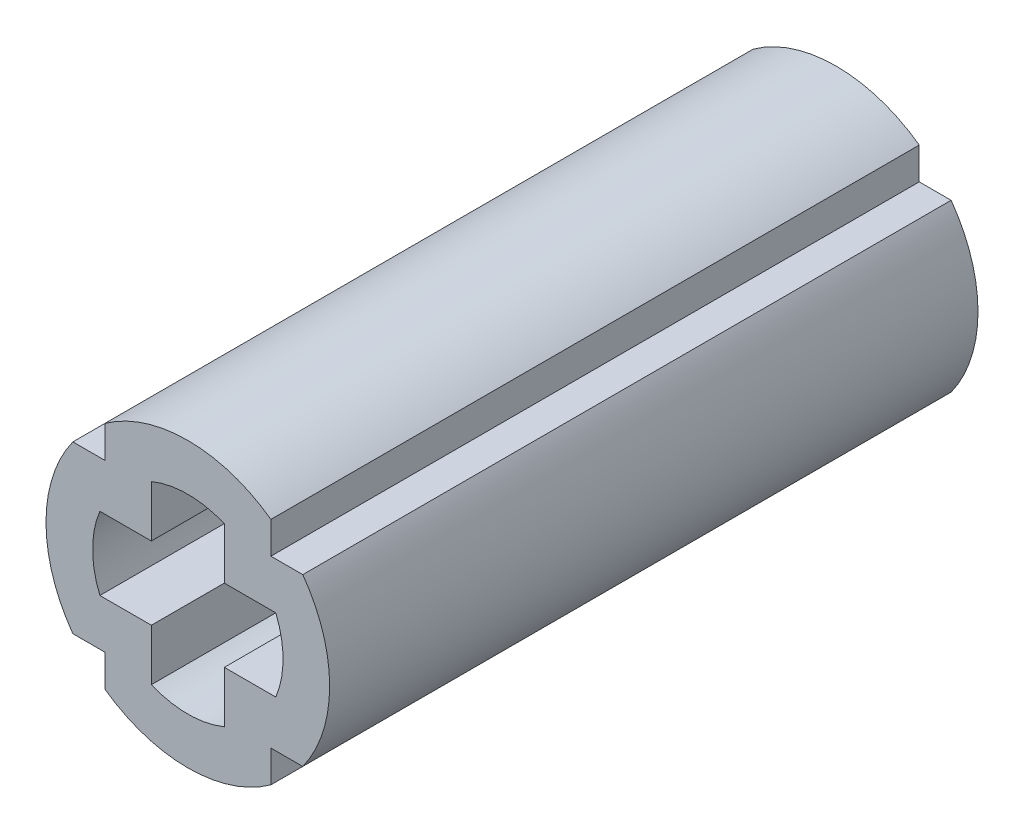
ISO-10303-21;
HEADER;
FILE_DESCRIPTION(('STEP AP214'),'2;1');
FILE_NAME('part.step','',(''),(''),'','','');
FILE_SCHEMA(('AUTOMOTIVE_DESIGN { 1 0 10303 214 1 1 1 1 }'));
ENDSEC;
DATA;
#1=APPLICATION_CONTEXT('core data for automotive mechanical design processes');
#2=APPLICATION_PROTOCOL_DEFINITION('international standard','automotive_design',2000,#1);
#3=PRODUCT_CONTEXT('',#1,'mechanical');
#4=PRODUCT('Part','Part','',(#3));
#5=PRODUCT_RELATED_PRODUCT_CATEGORY('part','',(#4));
#6=PRODUCT_DEFINITION_FORMATION('','',#4);
#7=PRODUCT_DEFINITION_CONTEXT('part definition',#1,'design');
#8=PRODUCT_DEFINITION('design','',#6,#7);
#9=PRODUCT_DEFINITION_SHAPE('','',#8);
#10=(LENGTH_UNIT() NAMED_UNIT(*) SI_UNIT(.MILLI.,.METRE.));
#11=(NAMED_UNIT(*) PLANE_ANGLE_UNIT() SI_UNIT($,.RADIAN.));
#12=(NAMED_UNIT(*) SI_UNIT($,.STERADIAN.) SOLID_ANGLE_UNIT());
#13=UNCERTAINTY_MEASURE_WITH_UNIT(LENGTH_MEASURE(1.E-05),#10,'distance_accuracy_value','');
#14=(GEOMETRIC_REPRESENTATION_CONTEXT(3) GLOBAL_UNCERTAINTY_ASSIGNED_CONTEXT((#13)) GLOBAL_UNIT_ASSIGNED_CONTEXT((#10,
#11,#12)) REPRESENTATION_CONTEXT('',''));
#15=CARTESIAN_POINT('',(0.,0.,0.));
#16=DIRECTION('',(0.,0.,1.));
#17=DIRECTION('',(1.,0.,0.));
#18=AXIS2_PLACEMENT_3D('',#15,#16,#17);
#19=CARTESIAN_POINT('',(0.,0.,16.));
#20=DIRECTION('',(0.,0.,1.));
#21=DIRECTION('',(1.,0.,0.));
#22=AXIS2_PLACEMENT_3D('',#19,#20,#21);
#23=PLANE('',#22);
#24=CARTESIAN_POINT('',(0.,0.,16.));
#25=DIRECTION('',(0.,0.,1.));
#26=DIRECTION('',(1.,0.,0.));
#27=AXIS2_PLACEMENT_3D('',#24,#25,#26);
#28=CIRCLE('',#27,3.5);
#29=CARTESIAN_POINT('',(2.05,2.83681159050086,16.));
#30=VERTEX_POINT('',#29);
#31=CARTESIAN_POINT('',(-2.05,2.83681159050086,16.));
#32=VERTEX_POINT('',#31);
#33=EDGE_CURVE('E286',#30,#32,#28,.T.);
#34=ORIENTED_EDGE('',*,*,#33,.T.);
#35=DIRECTION('',(0.,-1.,0.));
#36=VECTOR('',#35,1.);
#37=CARTESIAN_POINT('',(-2.05,2.83681159050086,16.));
#38=LINE('',#37,#36);
#39=CARTESIAN_POINT('',(-2.05,2.05,16.));
#40=VERTEX_POINT('',#39);
#41=EDGE_CURVE('E289',#32,#40,#38,.T.);
#42=ORIENTED_EDGE('',*,*,#41,.T.);
#43=DIRECTION('',(-1.,0.,0.));
#44=VECTOR('',#43,1.);
#45=CARTESIAN_POINT('',(-2.83681159050086,2.05,16.));
#46=LINE('',#45,#44);
#47=CARTESIAN_POINT('',(-2.83681159050086,2.05,16.));
#48=VERTEX_POINT('',#47);
#49=EDGE_CURVE('E292',#40,#48,#46,.T.);
#50=ORIENTED_EDGE('',*,*,#49,.T.);
#51=CARTESIAN_POINT('',(0.,0.,16.));
#52=DIRECTION('',(0.,0.,1.));
#53=DIRECTION('',(1.,0.,0.));
#54=AXIS2_PLACEMENT_3D('',#51,#52,#53);
#55=CIRCLE('',#54,3.5);
#56=CARTESIAN_POINT('',(-2.83681159050086,-2.05,16.));
#57=VERTEX_POINT('',#56);
#58=EDGE_CURVE('E294',#48,#57,#55,.T.);
#59=ORIENTED_EDGE('',*,*,#58,.T.);
#60=DIRECTION('',(1.,0.,0.));
#61=VECTOR('',#60,1.);
#62=CARTESIAN_POINT('',(-2.83681159050086,-2.05,16.));
#63=LINE('',#62,#61);
#64=CARTESIAN_POINT('',(-2.05,-2.05,16.));
#65=VERTEX_POINT('',#64);
#66=EDGE_CURVE('E296',#57,#65,#63,.T.);
#67=ORIENTED_EDGE('',*,*,#66,.T.);
#68=DIRECTION('',(0.,-1.,0.));
#69=VECTOR('',#68,1.);
#70=CARTESIAN_POINT('',(-2.05,-2.05,16.));
#71=LINE('',#70,#69);
#72=CARTESIAN_POINT('',(-2.05,-2.83681159050086,16.));
#73=VERTEX_POINT('',#72);
#74=EDGE_CURVE('E298',#65,#73,#71,.T.);
#75=ORIENTED_EDGE('',*,*,#74,.T.);
#76=CARTESIAN_POINT('',(0.,0.,16.));
#77=DIRECTION('',(0.,0.,1.));
#78=DIRECTION('',(1.,0.,0.));
#79=AXIS2_PLACEMENT_3D('',#76,#77,#78);
#80=CIRCLE('',#79,3.5);
#81=CARTESIAN_POINT('',(2.05,-2.83681159050086,16.));
#82=VERTEX_POINT('',#81);
#83=EDGE_CURVE('E300',#73,#82,#80,.T.);
#84=ORIENTED_EDGE('',*,*,#83,.T.);
#85=DIRECTION('',(0.,1.,0.));
#86=VECTOR('',#85,1.);
#87=CARTESIAN_POINT('',(2.05,-2.05,16.));
#88=LINE('',#87,#86);
#89=CARTESIAN_POINT('',(2.05,-2.05,16.));
#90=VERTEX_POINT('',#89);
#91=EDGE_CURVE('E302',#82,#90,#88,.T.);
#92=ORIENTED_EDGE('',*,*,#91,.T.);
#93=DIRECTION('',(1.,0.,0.));
#94=VECTOR('',#93,1.);
#95=CARTESIAN_POINT('',(2.05,-2.05,16.));
#96=LINE('',#95,#94);
#97=CARTESIAN_POINT('',(2.83681159050086,-2.05,16.));
#98=VERTEX_POINT('',#97);
#99=EDGE_CURVE('E304',#90,#98,#96,.T.);
#100=ORIENTED_EDGE('',*,*,#99,.T.);
#101=CARTESIAN_POINT('',(0.,0.,16.));
#102=DIRECTION('',(0.,0.,1.));
#103=DIRECTION('',(1.,0.,0.));
#104=AXIS2_PLACEMENT_3D('',#101,#102,#103);
#105=CIRCLE('',#104,3.5);
#106=CARTESIAN_POINT('',(2.83681159050086,2.05,16.));
#107=VERTEX_POINT('',#106);
#108=EDGE_CURVE('E306',#98,#107,#105,.T.);
#109=ORIENTED_EDGE('',*,*,#108,.T.);
#110=DIRECTION('',(-1.,0.,0.));
#111=VECTOR('',#110,1.);
#112=CARTESIAN_POINT('',(2.05,2.05,16.));
#113=LINE('',#112,#111);
#114=CARTESIAN_POINT('',(2.05,2.05,16.));
#115=VERTEX_POINT('',#114);
#116=EDGE_CURVE('E308',#107,#115,#113,.T.);
#117=ORIENTED_EDGE('',*,*,#116,.T.);
#118=DIRECTION('',(0.,1.,0.));
#119=VECTOR('',#118,1.);
#120=CARTESIAN_POINT('',(2.05,2.83681159050086,16.));
#121=LINE('',#120,#119);
#122=EDGE_CURVE('E310',#115,#30,#121,.T.);
#123=ORIENTED_EDGE('',*,*,#122,.T.);
#124=EDGE_LOOP('',(#34,#42,#50,#59,#67,#75,#84,#92,#100,#109,#117,#123));
#125=FACE_BOUND('',#124,.T.);
#126=DIRECTION('',(0.,-1.,0.));
#127=VECTOR('',#126,1.);
#128=CARTESIAN_POINT('',(-0.9,2.17082933460924,16.));
#129=LINE('',#128,#127);
#130=CARTESIAN_POINT('',(-0.9,2.17082933460924,16.));
#131=VERTEX_POINT('',#130);
#132=CARTESIAN_POINT('',(-0.9,0.9,16.));
#133=VERTEX_POINT('',#132);
#134=EDGE_CURVE('E201',#131,#133,#129,.T.);
#135=ORIENTED_EDGE('',*,*,#134,.F.);
#136=CARTESIAN_POINT('',(0.,0.,16.));
#137=DIRECTION('',(0.,0.,1.));
#138=DIRECTION('',(1.,0.,0.));
#139=AXIS2_PLACEMENT_3D('',#136,#137,#138);
#140=CIRCLE('',#139,2.35);
#141=CARTESIAN_POINT('',(0.9,2.17082933460924,16.));
#142=VERTEX_POINT('',#141);
#143=EDGE_CURVE('E193',#142,#131,#140,.T.);
#144=ORIENTED_EDGE('',*,*,#143,.F.);
#145=DIRECTION('',(0.,1.,0.));
#146=VECTOR('',#145,1.);
#147=CARTESIAN_POINT('',(0.9,2.17082933460924,16.));
#148=LINE('',#147,#146);
#149=CARTESIAN_POINT('',(0.9,0.9,16.));
#150=VERTEX_POINT('',#149);
#151=EDGE_CURVE('E234',#150,#142,#148,.T.);
#152=ORIENTED_EDGE('',*,*,#151,.F.);
#153=DIRECTION('',(-1.,0.,0.));
#154=VECTOR('',#153,1.);
#155=CARTESIAN_POINT('',(0.9,0.9,16.));
#156=LINE('',#155,#154);
#157=CARTESIAN_POINT('',(2.17082933460924,0.9,16.));
#158=VERTEX_POINT('',#157);
#159=EDGE_CURVE('E232',#158,#150,#156,.T.);
#160=ORIENTED_EDGE('',*,*,#159,.F.);
#161=CARTESIAN_POINT('',(0.,0.,16.));
#162=DIRECTION('',(0.,0.,1.));
#163=DIRECTION('',(1.,0.,0.));
#164=AXIS2_PLACEMENT_3D('',#161,#162,#163);
#165=CIRCLE('',#164,2.35);
#166=CARTESIAN_POINT('',(2.17082933460924,-0.900000000000001,16.));
#167=VERTEX_POINT('',#166);
#168=EDGE_CURVE('E230',#167,#158,#165,.T.);
#169=ORIENTED_EDGE('',*,*,#168,.F.);
#170=DIRECTION('',(1.,0.,0.));
#171=VECTOR('',#170,1.);
#172=CARTESIAN_POINT('',(0.9,-0.9,16.));
#173=LINE('',#172,#171);
#174=CARTESIAN_POINT('',(0.9,-0.9,16.));
#175=VERTEX_POINT('',#174);
#176=EDGE_CURVE('E228',#175,#167,#173,.T.);
#177=ORIENTED_EDGE('',*,*,#176,.F.);
#178=DIRECTION('',(0.,1.,0.));
#179=VECTOR('',#178,1.);
#180=CARTESIAN_POINT('',(0.9,-0.9,16.));
#181=LINE('',#180,#179);
#182=CARTESIAN_POINT('',(0.9,-2.17082933460924,16.));
#183=VERTEX_POINT('',#182);
#184=EDGE_CURVE('E226',#183,#175,#181,.T.);
#185=ORIENTED_EDGE('',*,*,#184,.F.);
#186=CARTESIAN_POINT('',(0.,0.,16.));
#187=DIRECTION('',(0.,0.,1.));
#188=DIRECTION('',(1.,0.,0.));
#189=AXIS2_PLACEMENT_3D('',#186,#187,#188);
#190=CIRCLE('',#189,2.35);
#191=CARTESIAN_POINT('',(-0.899999999999999,-2.17082933460924,16.));
#192=VERTEX_POINT('',#191);
#193=EDGE_CURVE('E224',#192,#183,#190,.T.);
#194=ORIENTED_EDGE('',*,*,#193,.F.);
#195=DIRECTION('',(0.,-1.,0.));
#196=VECTOR('',#195,1.);
#197=CARTESIAN_POINT('',(-0.9,-0.9,16.));
#198=LINE('',#197,#196);
#199=CARTESIAN_POINT('',(-0.9,-0.9,16.));
#200=VERTEX_POINT('',#199);
#201=EDGE_CURVE('E222',#200,#192,#198,.T.);
#202=ORIENTED_EDGE('',*,*,#201,.F.);
#203=DIRECTION('',(1.,0.,0.));
#204=VECTOR('',#203,1.);
#205=CARTESIAN_POINT('',(-2.17082933460924,-0.9,16.));
#206=LINE('',#205,#204);
#207=CARTESIAN_POINT('',(-2.17082933460924,-0.9,16.));
#208=VERTEX_POINT('',#207);
#209=EDGE_CURVE('E220',#208,#200,#206,.T.);
#210=ORIENTED_EDGE('',*,*,#209,.F.);
#211=CARTESIAN_POINT('',(0.,0.,16.));
#212=DIRECTION('',(0.,0.,1.));
#213=DIRECTION('',(1.,0.,0.));
#214=AXIS2_PLACEMENT_3D('',#211,#212,#213);
#215=CIRCLE('',#214,2.35);
#216=CARTESIAN_POINT('',(-2.17082933460924,0.9,16.));
#217=VERTEX_POINT('',#216);
#218=EDGE_CURVE('E216',#217,#208,#215,.T.);
#219=ORIENTED_EDGE('',*,*,#218,.F.);
#220=DIRECTION('',(-1.,0.,0.));
#221=VECTOR('',#220,1.);
#222=CARTESIAN_POINT('',(-2.17082933460924,0.9,16.));
#223=LINE('',#222,#221);
#224=EDGE_CURVE('E214',#133,#217,#223,.T.);
#225=ORIENTED_EDGE('',*,*,#224,.F.);
#226=EDGE_LOOP('',(#135,#144,#152,#160,#169,#177,#185,#194,#202,#210,#219,#225));
#227=FACE_BOUND('',#226,.T.);
#228=ADVANCED_FACE('F32',(#125,#227),#23,.T.);
#229=CARTESIAN_POINT('',(0.,0.,0.));
#230=DIRECTION('',(0.,0.,1.));
#231=DIRECTION('',(1.,0.,0.));
#232=AXIS2_PLACEMENT_3D('',#229,#230,#231);
#233=PLANE('',#232);
#234=CARTESIAN_POINT('',(0.,0.,0.));
#235=DIRECTION('',(0.,0.,1.));
#236=DIRECTION('',(1.,0.,0.));
#237=AXIS2_PLACEMENT_3D('',#234,#235,#236);
#238=CIRCLE('',#237,3.5);
#239=CARTESIAN_POINT('',(2.05,2.83681159050086,0.));
#240=VERTEX_POINT('',#239);
#241=CARTESIAN_POINT('',(-2.05,2.83681159050086,0.));
#242=VERTEX_POINT('',#241);
#243=EDGE_CURVE('E209',#240,#242,#238,.T.);
#244=ORIENTED_EDGE('',*,*,#243,.F.);
#245=DIRECTION('',(0.,1.,0.));
#246=VECTOR('',#245,1.);
#247=CARTESIAN_POINT('',(2.05,2.83681159050086,0.));
#248=LINE('',#247,#246);
#249=CARTESIAN_POINT('',(2.05,2.05,0.));
#250=VERTEX_POINT('',#249);
#251=EDGE_CURVE('E290',#250,#240,#248,.T.);
#252=ORIENTED_EDGE('',*,*,#251,.F.);
#253=DIRECTION('',(-1.,0.,0.));
#254=VECTOR('',#253,1.);
#255=CARTESIAN_POINT('',(2.05,2.05,0.));
#256=LINE('',#255,#254);
#257=CARTESIAN_POINT('',(2.83681159050086,2.05,0.));
#258=VERTEX_POINT('',#257);
#259=EDGE_CURVE('E333',#258,#250,#256,.T.);
#260=ORIENTED_EDGE('',*,*,#259,.F.);
#261=CARTESIAN_POINT('',(0.,0.,0.));
#262=DIRECTION('',(0.,0.,1.));
#263=DIRECTION('',(1.,0.,0.));
#264=AXIS2_PLACEMENT_3D('',#261,#262,#263);
#265=CIRCLE('',#264,3.5);
#266=CARTESIAN_POINT('',(2.83681159050086,-2.05,0.));
#267=VERTEX_POINT('',#266);
#268=EDGE_CURVE('E331',#267,#258,#265,.T.);
#269=ORIENTED_EDGE('',*,*,#268,.F.);
#270=DIRECTION('',(1.,0.,0.));
#271=VECTOR('',#270,1.);
#272=CARTESIAN_POINT('',(2.05,-2.05,0.));
#273=LINE('',#272,#271);
#274=CARTESIAN_POINT('',(2.05,-2.05,0.));
#275=VERTEX_POINT('',#274);
#276=EDGE_CURVE('E329',#275,#267,#273,.T.);
#277=ORIENTED_EDGE('',*,*,#276,.F.);
#278=DIRECTION('',(0.,1.,0.));
#279=VECTOR('',#278,1.);
#280=CARTESIAN_POINT('',(2.05,-2.05,0.));
#281=LINE('',#280,#279);
#282=CARTESIAN_POINT('',(2.05,-2.83681159050086,0.));
#283=VERTEX_POINT('',#282);
#284=EDGE_CURVE('E327',#283,#275,#281,.T.);
#285=ORIENTED_EDGE('',*,*,#284,.F.);
#286=CARTESIAN_POINT('',(0.,0.,0.));
#287=DIRECTION('',(0.,0.,1.));
#288=DIRECTION('',(1.,0.,0.));
#289=AXIS2_PLACEMENT_3D('',#286,#287,#288);
#290=CIRCLE('',#289,3.5);
#291=CARTESIAN_POINT('',(-2.05,-2.83681159050086,0.));
#292=VERTEX_POINT('',#291);
#293=EDGE_CURVE('E325',#292,#283,#290,.T.);
#294=ORIENTED_EDGE('',*,*,#293,.F.);
#295=DIRECTION('',(0.,-1.,0.));
#296=VECTOR('',#295,1.);
#297=CARTESIAN_POINT('',(-2.05,-2.05,0.));
#298=LINE('',#297,#296);
#299=CARTESIAN_POINT('',(-2.05,-2.05,0.));
#300=VERTEX_POINT('',#299);
#301=EDGE_CURVE('E323',#300,#292,#298,.T.);
#302=ORIENTED_EDGE('',*,*,#301,.F.);
#303=DIRECTION('',(1.,0.,0.));
#304=VECTOR('',#303,1.);
#305=CARTESIAN_POINT('',(-2.83681159050086,-2.05,0.));
#306=LINE('',#305,#304);
#307=CARTESIAN_POINT('',(-2.83681159050086,-2.05,0.));
#308=VERTEX_POINT('',#307);
#309=EDGE_CURVE('E321',#308,#300,#306,.T.);
#310=ORIENTED_EDGE('',*,*,#309,.F.);
#311=CARTESIAN_POINT('',(0.,0.,0.));
#312=DIRECTION('',(0.,0.,1.));
#313=DIRECTION('',(1.,0.,0.));
#314=AXIS2_PLACEMENT_3D('',#311,#312,#313);
#315=CIRCLE('',#314,3.5);
#316=CARTESIAN_POINT('',(-2.83681159050086,2.05,0.));
#317=VERTEX_POINT('',#316);
#318=EDGE_CURVE('E319',#317,#308,#315,.T.);
#319=ORIENTED_EDGE('',*,*,#318,.F.);
#320=DIRECTION('',(-1.,0.,0.));
#321=VECTOR('',#320,1.);
#322=CARTESIAN_POINT('',(-2.83681159050086,2.05,0.));
#323=LINE('',#322,#321);
#324=CARTESIAN_POINT('',(-2.05,2.05,0.));
#325=VERTEX_POINT('',#324);
#326=EDGE_CURVE('E317',#325,#317,#323,.T.);
#327=ORIENTED_EDGE('',*,*,#326,.F.);
#328=DIRECTION('',(0.,-1.,0.));
#329=VECTOR('',#328,1.);
#330=CARTESIAN_POINT('',(-2.05,2.83681159050086,0.));
#331=LINE('',#330,#329);
#332=EDGE_CURVE('E315',#242,#325,#331,.T.);
#333=ORIENTED_EDGE('',*,*,#332,.F.);
#334=EDGE_LOOP('',(#244,#252,#260,#269,#277,#285,#294,#302,#310,#319,#327,#333));
#335=FACE_BOUND('',#334,.T.);
#336=CARTESIAN_POINT('',(0.,0.,0.));
#337=DIRECTION('',(0.,0.,1.));
#338=DIRECTION('',(1.,0.,0.));
#339=AXIS2_PLACEMENT_3D('',#336,#337,#338);
#340=CIRCLE('',#339,2.35);
#341=CARTESIAN_POINT('',(0.9,2.17082933460924,0.));
#342=VERTEX_POINT('',#341);
#343=CARTESIAN_POINT('',(-0.9,2.17082933460924,0.));
#344=VERTEX_POINT('',#343);
#345=EDGE_CURVE('E55',#342,#344,#340,.T.);
#346=ORIENTED_EDGE('',*,*,#345,.T.);
#347=DIRECTION('',(0.,-1.,0.));
#348=VECTOR('',#347,1.);
#349=CARTESIAN_POINT('',(-0.9,2.17082933460924,0.));
#350=LINE('',#349,#348);
#351=CARTESIAN_POINT('',(-0.9,0.9,0.));
#352=VERTEX_POINT('',#351);
#353=EDGE_CURVE('E208',#344,#352,#350,.T.);
#354=ORIENTED_EDGE('',*,*,#353,.T.);
#355=DIRECTION('',(-1.,0.,0.));
#356=VECTOR('',#355,1.);
#357=CARTESIAN_POINT('',(-2.17082933460924,0.9,0.));
#358=LINE('',#357,#356);
#359=CARTESIAN_POINT('',(-2.17082933460924,0.9,0.));
#360=VERTEX_POINT('',#359);
#361=EDGE_CURVE('E238',#352,#360,#358,.T.);
#362=ORIENTED_EDGE('',*,*,#361,.T.);
#363=CARTESIAN_POINT('',(0.,0.,0.));
#364=DIRECTION('',(0.,0.,1.));
#365=DIRECTION('',(1.,0.,0.));
#366=AXIS2_PLACEMENT_3D('',#363,#364,#365);
#367=CIRCLE('',#366,2.35);
#368=CARTESIAN_POINT('',(-2.17082933460924,-0.9,0.));
#369=VERTEX_POINT('',#368);
#370=EDGE_CURVE('E241',#360,#369,#367,.T.);
#371=ORIENTED_EDGE('',*,*,#370,.T.);
#372=DIRECTION('',(1.,0.,0.));
#373=VECTOR('',#372,1.);
#374=CARTESIAN_POINT('',(-2.17082933460924,-0.9,0.));
#375=LINE('',#374,#373);
#376=CARTESIAN_POINT('',(-0.9,-0.9,0.));
#377=VERTEX_POINT('',#376);
#378=EDGE_CURVE('E244',#369,#377,#375,.T.);
#379=ORIENTED_EDGE('',*,*,#378,.T.);
#380=DIRECTION('',(0.,-1.,0.));
#381=VECTOR('',#380,1.);
#382=CARTESIAN_POINT('',(-0.9,-0.9,0.));
#383=LINE('',#382,#381);
#384=CARTESIAN_POINT('',(-0.899999999999999,-2.17082933460924,0.));
#385=VERTEX_POINT('',#384);
#386=EDGE_CURVE('E247',#377,#385,#383,.T.);
#387=ORIENTED_EDGE('',*,*,#386,.T.);
#388=CARTESIAN_POINT('',(0.,0.,0.));
#389=DIRECTION('',(0.,0.,1.));
#390=DIRECTION('',(1.,0.,0.));
#391=AXIS2_PLACEMENT_3D('',#388,#389,#390);
#392=CIRCLE('',#391,2.35);
#393=CARTESIAN_POINT('',(0.9,-2.17082933460924,0.));
#394=VERTEX_POINT('',#393);
#395=EDGE_CURVE('E250',#385,#394,#392,.T.);
#396=ORIENTED_EDGE('',*,*,#395,.T.);
#397=DIRECTION('',(0.,1.,0.));
#398=VECTOR('',#397,1.);
#399=CARTESIAN_POINT('',(0.9,-0.9,0.));
#400=LINE('',#399,#398);
#401=CARTESIAN_POINT('',(0.9,-0.9,0.));
#402=VERTEX_POINT('',#401);
#403=EDGE_CURVE('E253',#394,#402,#400,.T.);
#404=ORIENTED_EDGE('',*,*,#403,.T.);
#405=DIRECTION('',(1.,0.,0.));
#406=VECTOR('',#405,1.);
#407=CARTESIAN_POINT('',(0.9,-0.9,0.));
#408=LINE('',#407,#406);
#409=CARTESIAN_POINT('',(2.17082933460924,-0.900000000000001,0.));
#410=VERTEX_POINT('',#409);
#411=EDGE_CURVE('E256',#402,#410,#408,.T.);
#412=ORIENTED_EDGE('',*,*,#411,.T.);
#413=CARTESIAN_POINT('',(0.,0.,0.));
#414=DIRECTION('',(0.,0.,1.));
#415=DIRECTION('',(1.,0.,0.));
#416=AXIS2_PLACEMENT_3D('',#413,#414,#415);
#417=CIRCLE('',#416,2.35);
#418=CARTESIAN_POINT('',(2.17082933460924,0.9,0.));
#419=VERTEX_POINT('',#418);
#420=EDGE_CURVE('E259',#410,#419,#417,.T.);
#421=ORIENTED_EDGE('',*,*,#420,.T.);
#422=DIRECTION('',(-1.,0.,0.));
#423=VECTOR('',#422,1.);
#424=CARTESIAN_POINT('',(0.9,0.9,0.));
#425=LINE('',#424,#423);
#426=CARTESIAN_POINT('',(0.9,0.9,0.));
#427=VERTEX_POINT('',#426);
#428=EDGE_CURVE('E262',#419,#427,#425,.T.);
#429=ORIENTED_EDGE('',*,*,#428,.T.);
#430=DIRECTION('',(0.,1.,0.));
#431=VECTOR('',#430,1.);
#432=CARTESIAN_POINT('',(0.9,2.17082933460924,0.));
#433=LINE('',#432,#431);
#434=EDGE_CURVE('E202',#427,#342,#433,.T.);
#435=ORIENTED_EDGE('',*,*,#434,.T.);
#436=EDGE_LOOP('',(#346,#354,#362,#371,#379,#387,#396,#404,#412,#421,#429,#435));
#437=FACE_BOUND('',#436,.T.);
#438=ADVANCED_FACE('F375',(#335,#437),#233,.F.);
#439=CARTESIAN_POINT('',(0.,0.,16.));
#440=DIRECTION('',(0.,0.,-1.));
#441=DIRECTION('',(-1.,0.,0.));
#442=AXIS2_PLACEMENT_3D('',#439,#440,#441);
#443=CYLINDRICAL_SURFACE('',#442,3.5);
#444=ORIENTED_EDGE('',*,*,#243,.T.);
#445=DIRECTION('',(0.,0.,-1.));
#446=VECTOR('',#445,1.);
#447=CARTESIAN_POINT('',(-2.05,2.83681159050086,16.));
#448=LINE('',#447,#446);
#449=EDGE_CURVE('E11',#32,#242,#448,.T.);
#450=ORIENTED_EDGE('',*,*,#449,.F.);
#451=ORIENTED_EDGE('',*,*,#33,.F.);
#452=DIRECTION('',(0.,0.,-1.));
#453=VECTOR('',#452,1.);
#454=CARTESIAN_POINT('',(2.05,2.83681159050086,16.));
#455=LINE('',#454,#453);
#456=EDGE_CURVE('E312',#30,#240,#455,.T.);
#457=ORIENTED_EDGE('',*,*,#456,.T.);
#458=EDGE_LOOP('',(#444,#450,#451,#457));
#459=FACE_BOUND('',#458,.T.);
#460=ADVANCED_FACE('F34',(#459),#443,.T.);
#461=CARTESIAN_POINT('',(-2.05,2.83681159050086,16.));
#462=DIRECTION('',(1.,0.,0.));
#463=DIRECTION('',(0.,0.,-1.));
#464=AXIS2_PLACEMENT_3D('',#461,#462,#463);
#465=PLANE('',#464);
#466=ORIENTED_EDGE('',*,*,#332,.T.);
#467=DIRECTION('',(0.,0.,-1.));
#468=VECTOR('',#467,1.);
#469=CARTESIAN_POINT('',(-2.05,2.05,16.));
#470=LINE('',#469,#468);
#471=EDGE_CURVE('E40',#40,#325,#470,.T.);
#472=ORIENTED_EDGE('',*,*,#471,.F.);
#473=ORIENTED_EDGE('',*,*,#41,.F.);
#474=ORIENTED_EDGE('',*,*,#449,.T.);
#475=EDGE_LOOP('',(#466,#472,#473,#474));
#476=FACE_BOUND('',#475,.T.);
#477=ADVANCED_FACE('F392',(#476),#465,.F.);
#478=CARTESIAN_POINT('',(-2.83681159050086,2.05,16.));
#479=DIRECTION('',(0.,-1.,0.));
#480=DIRECTION('',(0.,0.,-1.));
#481=AXIS2_PLACEMENT_3D('',#478,#479,#480);
#482=PLANE('',#481);
#483=ORIENTED_EDGE('',*,*,#326,.T.);
#484=DIRECTION('',(0.,0.,-1.));
#485=VECTOR('',#484,1.);
#486=CARTESIAN_POINT('',(-2.83681159050086,2.05,16.));
#487=LINE('',#486,#485);
#488=EDGE_CURVE('E362',#48,#317,#487,.T.);
#489=ORIENTED_EDGE('',*,*,#488,.F.);
#490=ORIENTED_EDGE('',*,*,#49,.F.);
#491=ORIENTED_EDGE('',*,*,#471,.T.);
#492=EDGE_LOOP('',(#483,#489,#490,#491));
#493=FACE_BOUND('',#492,.T.);
#494=ADVANCED_FACE('F369',(#493),#482,.F.);
#495=CARTESIAN_POINT('',(0.,0.,16.));
#496=DIRECTION('',(0.,0.,-1.));
#497=DIRECTION('',(-1.,0.,0.));
#498=AXIS2_PLACEMENT_3D('',#495,#496,#497);
#499=CYLINDRICAL_SURFACE('',#498,3.5);
#500=ORIENTED_EDGE('',*,*,#318,.T.);
#501=DIRECTION('',(0.,0.,-1.));
#502=VECTOR('',#501,1.);
#503=CARTESIAN_POINT('',(-2.83681159050086,-2.05,16.));
#504=LINE('',#503,#502);
#505=EDGE_CURVE('E359',#57,#308,#504,.T.);
#506=ORIENTED_EDGE('',*,*,#505,.F.);
#507=ORIENTED_EDGE('',*,*,#58,.F.);
#508=ORIENTED_EDGE('',*,*,#488,.T.);
#509=EDGE_LOOP('',(#500,#506,#507,#508));
#510=FACE_BOUND('',#509,.T.);
#511=ADVANCED_FACE('F381',(#510),#499,.T.);
#512=CARTESIAN_POINT('',(-2.83681159050086,-2.05,16.));
#513=DIRECTION('',(0.,1.,0.));
#514=DIRECTION('',(0.,0.,1.));
#515=AXIS2_PLACEMENT_3D('',#512,#513,#514);
#516=PLANE('',#515);
#517=ORIENTED_EDGE('',*,*,#309,.T.);
#518=DIRECTION('',(0.,0.,-1.));
#519=VECTOR('',#518,1.);
#520=CARTESIAN_POINT('',(-2.05,-2.05,16.));
#521=LINE('',#520,#519);
#522=EDGE_CURVE('E356',#65,#300,#521,.T.);
#523=ORIENTED_EDGE('',*,*,#522,.F.);
#524=ORIENTED_EDGE('',*,*,#66,.F.);
#525=ORIENTED_EDGE('',*,*,#505,.T.);
#526=EDGE_LOOP('',(#517,#523,#524,#525));
#527=FACE_BOUND('',#526,.T.);
#528=ADVANCED_FACE('F385',(#527),#516,.F.);
#529=CARTESIAN_POINT('',(-2.05,-2.05,16.));
#530=DIRECTION('',(1.,0.,0.));
#531=DIRECTION('',(0.,0.,-1.));
#532=AXIS2_PLACEMENT_3D('',#529,#530,#531);
#533=PLANE('',#532);
#534=ORIENTED_EDGE('',*,*,#301,.T.);
#535=DIRECTION('',(0.,0.,-1.));
#536=VECTOR('',#535,1.);
#537=CARTESIAN_POINT('',(-2.05,-2.83681159050086,16.));
#538=LINE('',#537,#536);
#539=EDGE_CURVE('E353',#73,#292,#538,.T.);
#540=ORIENTED_EDGE('',*,*,#539,.F.);
#541=ORIENTED_EDGE('',*,*,#74,.F.);
#542=ORIENTED_EDGE('',*,*,#522,.T.);
#543=EDGE_LOOP('',(#534,#540,#541,#542));
#544=FACE_BOUND('',#543,.T.);
#545=ADVANCED_FACE('F425',(#544),#533,.F.);
#546=CARTESIAN_POINT('',(0.,0.,16.));
#547=DIRECTION('',(0.,0.,-1.));
#548=DIRECTION('',(-1.,0.,0.));
#549=AXIS2_PLACEMENT_3D('',#546,#547,#548);
#550=CYLINDRICAL_SURFACE('',#549,3.5);
#551=ORIENTED_EDGE('',*,*,#293,.T.);
#552=DIRECTION('',(0.,0.,-1.));
#553=VECTOR('',#552,1.);
#554=CARTESIAN_POINT('',(2.05,-2.83681159050086,16.));
#555=LINE('',#554,#553);
#556=EDGE_CURVE('E350',#82,#283,#555,.T.);
#557=ORIENTED_EDGE('',*,*,#556,.F.);
#558=ORIENTED_EDGE('',*,*,#83,.F.);
#559=ORIENTED_EDGE('',*,*,#539,.T.);
#560=EDGE_LOOP('',(#551,#557,#558,#559));
#561=FACE_BOUND('',#560,.T.);
#562=ADVANCED_FACE('F423',(#561),#550,.T.);
#563=CARTESIAN_POINT('',(2.05,-2.05,16.));
#564=DIRECTION('',(-1.,0.,0.));
#565=DIRECTION('',(0.,0.,1.));
#566=AXIS2_PLACEMENT_3D('',#563,#564,#565);
#567=PLANE('',#566);
#568=ORIENTED_EDGE('',*,*,#284,.T.);
#569=DIRECTION('',(0.,0.,-1.));
#570=VECTOR('',#569,1.);
#571=CARTESIAN_POINT('',(2.05,-2.05,16.));
#572=LINE('',#571,#570);
#573=EDGE_CURVE('E347',#90,#275,#572,.T.);
#574=ORIENTED_EDGE('',*,*,#573,.F.);
#575=ORIENTED_EDGE('',*,*,#91,.F.);
#576=ORIENTED_EDGE('',*,*,#556,.T.);
#577=EDGE_LOOP('',(#568,#574,#575,#576));
#578=FACE_BOUND('',#577,.T.);
#579=ADVANCED_FACE('F419',(#578),#567,.F.);
#580=CARTESIAN_POINT('',(2.05,-2.05,16.));
#581=DIRECTION('',(0.,1.,0.));
#582=DIRECTION('',(0.,0.,1.));
#583=AXIS2_PLACEMENT_3D('',#580,#581,#582);
#584=PLANE('',#583);
#585=ORIENTED_EDGE('',*,*,#276,.T.);
#586=DIRECTION('',(0.,0.,-1.));
#587=VECTOR('',#586,1.);
#588=CARTESIAN_POINT('',(2.83681159050086,-2.05,16.));
#589=LINE('',#588,#587);
#590=EDGE_CURVE('E344',#98,#267,#589,.T.);
#591=ORIENTED_EDGE('',*,*,#590,.F.);
#592=ORIENTED_EDGE('',*,*,#99,.F.);
#593=ORIENTED_EDGE('',*,*,#573,.T.);
#594=EDGE_LOOP('',(#585,#591,#592,#593));
#595=FACE_BOUND('',#594,.T.);
#596=ADVANCED_FACE('F414',(#595),#584,.F.);
#597=CARTESIAN_POINT('',(0.,0.,16.));
#598=DIRECTION('',(0.,0.,-1.));
#599=DIRECTION('',(-1.,0.,0.));
#600=AXIS2_PLACEMENT_3D('',#597,#598,#599);
#601=CYLINDRICAL_SURFACE('',#600,3.5);
#602=ORIENTED_EDGE('',*,*,#268,.T.);
#603=DIRECTION('',(0.,0.,-1.));
#604=VECTOR('',#603,1.);
#605=CARTESIAN_POINT('',(2.83681159050086,2.05,16.));
#606=LINE('',#605,#604);
#607=EDGE_CURVE('E341',#107,#258,#606,.T.);
#608=ORIENTED_EDGE('',*,*,#607,.F.);
#609=ORIENTED_EDGE('',*,*,#108,.F.);
#610=ORIENTED_EDGE('',*,*,#590,.T.);
#611=EDGE_LOOP('',(#602,#608,#609,#610));
#612=FACE_BOUND('',#611,.T.);
#613=ADVANCED_FACE('F408',(#612),#601,.T.);
#614=CARTESIAN_POINT('',(2.05,2.05,16.));
#615=DIRECTION('',(0.,-1.,0.));
#616=DIRECTION('',(0.,0.,-1.));
#617=AXIS2_PLACEMENT_3D('',#614,#615,#616);
#618=PLANE('',#617);
#619=ORIENTED_EDGE('',*,*,#259,.T.);
#620=DIRECTION('',(0.,0.,-1.));
#621=VECTOR('',#620,1.);
#622=CARTESIAN_POINT('',(2.05,2.05,16.));
#623=LINE('',#622,#621);
#624=EDGE_CURVE('E338',#115,#250,#623,.T.);
#625=ORIENTED_EDGE('',*,*,#624,.F.);
#626=ORIENTED_EDGE('',*,*,#116,.F.);
#627=ORIENTED_EDGE('',*,*,#607,.T.);
#628=EDGE_LOOP('',(#619,#625,#626,#627));
#629=FACE_BOUND('',#628,.T.);
#630=ADVANCED_FACE('F404',(#629),#618,.F.);
#631=CARTESIAN_POINT('',(2.05,2.83681159050086,16.));
#632=DIRECTION('',(-1.,0.,0.));
#633=DIRECTION('',(0.,0.,1.));
#634=AXIS2_PLACEMENT_3D('',#631,#632,#633);
#635=PLANE('',#634);
#636=ORIENTED_EDGE('',*,*,#251,.T.);
#637=ORIENTED_EDGE('',*,*,#456,.F.);
#638=ORIENTED_EDGE('',*,*,#122,.F.);
#639=ORIENTED_EDGE('',*,*,#624,.T.);
#640=EDGE_LOOP('',(#636,#637,#638,#639));
#641=FACE_BOUND('',#640,.T.);
#642=ADVANCED_FACE('F399',(#641),#635,.F.);
#643=CARTESIAN_POINT('',(0.,0.,16.));
#644=DIRECTION('',(0.,0.,-1.));
#645=DIRECTION('',(-1.,0.,0.));
#646=AXIS2_PLACEMENT_3D('',#643,#644,#645);
#647=CYLINDRICAL_SURFACE('',#646,2.35);
#648=ORIENTED_EDGE('',*,*,#345,.F.);
#649=DIRECTION('',(0.,0.,-1.));
#650=VECTOR('',#649,1.);
#651=CARTESIAN_POINT('',(0.9,2.17082933460924,16.));
#652=LINE('',#651,#650);
#653=EDGE_CURVE('E197',#142,#342,#652,.T.);
#654=ORIENTED_EDGE('',*,*,#653,.F.);
#655=ORIENTED_EDGE('',*,*,#143,.T.);
#656=DIRECTION('',(0.,0.,-1.));
#657=VECTOR('',#656,1.);
#658=CARTESIAN_POINT('',(-0.9,2.17082933460924,16.));
#659=LINE('',#658,#657);
#660=EDGE_CURVE('E196',#131,#344,#659,.T.);
#661=ORIENTED_EDGE('',*,*,#660,.T.);
#662=EDGE_LOOP('',(#648,#654,#655,#661));
#663=FACE_BOUND('',#662,.T.);
#664=ADVANCED_FACE('F195',(#663),#647,.F.);
#665=CARTESIAN_POINT('',(-0.9,2.17082933460924,16.));
#666=DIRECTION('',(1.,0.,0.));
#667=DIRECTION('',(0.,1.,0.));
#668=AXIS2_PLACEMENT_3D('',#665,#666,#667);
#669=PLANE('',#668);
#670=ORIENTED_EDGE('',*,*,#353,.F.);
#671=ORIENTED_EDGE('',*,*,#660,.F.);
#672=ORIENTED_EDGE('',*,*,#134,.T.);
#673=DIRECTION('',(0.,0.,-1.));
#674=VECTOR('',#673,1.);
#675=CARTESIAN_POINT('',(-0.9,0.9,16.));
#676=LINE('',#675,#674);
#677=EDGE_CURVE('E210',#133,#352,#676,.T.);
#678=ORIENTED_EDGE('',*,*,#677,.T.);
#679=EDGE_LOOP('',(#670,#671,#672,#678));
#680=FACE_BOUND('',#679,.T.);
#681=ADVANCED_FACE('F205',(#680),#669,.T.);
#682=CARTESIAN_POINT('',(-2.17082933460924,0.9,16.));
#683=DIRECTION('',(0.,-1.,0.));
#684=DIRECTION('',(0.,0.,-1.));
#685=AXIS2_PLACEMENT_3D('',#682,#683,#684);
#686=PLANE('',#685);
#687=ORIENTED_EDGE('',*,*,#361,.F.);
#688=ORIENTED_EDGE('',*,*,#677,.F.);
#689=ORIENTED_EDGE('',*,*,#224,.T.);
#690=DIRECTION('',(0.,0.,-1.));
#691=VECTOR('',#690,1.);
#692=CARTESIAN_POINT('',(-2.17082933460924,0.9,16.));
#693=LINE('',#692,#691);
#694=EDGE_CURVE('E283',#217,#360,#693,.T.);
#695=ORIENTED_EDGE('',*,*,#694,.T.);
#696=EDGE_LOOP('',(#687,#688,#689,#695));
#697=FACE_BOUND('',#696,.T.);
#698=ADVANCED_FACE('F483',(#697),#686,.T.);
#699=CARTESIAN_POINT('',(0.,0.,16.));
#700=DIRECTION('',(0.,0.,-1.));
#701=DIRECTION('',(-1.,0.,0.));
#702=AXIS2_PLACEMENT_3D('',#699,#700,#701);
#703=CYLINDRICAL_SURFACE('',#702,2.35);
#704=ORIENTED_EDGE('',*,*,#370,.F.);
#705=ORIENTED_EDGE('',*,*,#694,.F.);
#706=ORIENTED_EDGE('',*,*,#218,.T.);
#707=DIRECTION('',(0.,0.,-1.));
#708=VECTOR('',#707,1.);
#709=CARTESIAN_POINT('',(-2.17082933460924,-0.9,16.));
#710=LINE('',#709,#708);
#711=EDGE_CURVE('E281',#208,#369,#710,.T.);
#712=ORIENTED_EDGE('',*,*,#711,.T.);
#713=EDGE_LOOP('',(#704,#705,#706,#712));
#714=FACE_BOUND('',#713,.T.);
#715=ADVANCED_FACE('F489',(#714),#703,.F.);
#716=CARTESIAN_POINT('',(-2.17082933460924,-0.9,16.));
#717=DIRECTION('',(0.,1.,0.));
#718=DIRECTION('',(-1.,0.,0.));
#719=AXIS2_PLACEMENT_3D('',#716,#717,#718);
#720=PLANE('',#719);
#721=ORIENTED_EDGE('',*,*,#378,.F.);
#722=ORIENTED_EDGE('',*,*,#711,.F.);
#723=ORIENTED_EDGE('',*,*,#209,.T.);
#724=DIRECTION('',(0.,0.,-1.));
#725=VECTOR('',#724,1.);
#726=CARTESIAN_POINT('',(-0.9,-0.9,16.));
#727=LINE('',#726,#725);
#728=EDGE_CURVE('E279',#200,#377,#727,.T.);
#729=ORIENTED_EDGE('',*,*,#728,.T.);
#730=EDGE_LOOP('',(#721,#722,#723,#729));
#731=FACE_BOUND('',#730,.T.);
#732=ADVANCED_FACE('F497',(#731),#720,.T.);
#733=CARTESIAN_POINT('',(-0.9,-0.9,16.));
#734=DIRECTION('',(1.,0.,0.));
#735=DIRECTION('',(0.,1.,0.));
#736=AXIS2_PLACEMENT_3D('',#733,#734,#735);
#737=PLANE('',#736);
#738=ORIENTED_EDGE('',*,*,#386,.F.);
#739=ORIENTED_EDGE('',*,*,#728,.F.);
#740=ORIENTED_EDGE('',*,*,#201,.T.);
#741=DIRECTION('',(0.,0.,-1.));
#742=VECTOR('',#741,1.);
#743=CARTESIAN_POINT('',(-0.899999999999999,-2.17082933460924,16.));
#744=LINE('',#743,#742);
#745=EDGE_CURVE('E277',#192,#385,#744,.T.);
#746=ORIENTED_EDGE('',*,*,#745,.T.);
#747=EDGE_LOOP('',(#738,#739,#740,#746));
#748=FACE_BOUND('',#747,.T.);
#749=ADVANCED_FACE('F505',(#748),#737,.T.);
#750=CARTESIAN_POINT('',(0.,0.,16.));
#751=DIRECTION('',(0.,0.,-1.));
#752=DIRECTION('',(-1.,0.,0.));
#753=AXIS2_PLACEMENT_3D('',#750,#751,#752);
#754=CYLINDRICAL_SURFACE('',#753,2.35);
#755=ORIENTED_EDGE('',*,*,#395,.F.);
#756=ORIENTED_EDGE('',*,*,#745,.F.);
#757=ORIENTED_EDGE('',*,*,#193,.T.);
#758=DIRECTION('',(0.,0.,-1.));
#759=VECTOR('',#758,1.);
#760=CARTESIAN_POINT('',(0.9,-2.17082933460924,16.));
#761=LINE('',#760,#759);
#762=EDGE_CURVE('E275',#183,#394,#761,.T.);
#763=ORIENTED_EDGE('',*,*,#762,.T.);
#764=EDGE_LOOP('',(#755,#756,#757,#763));
#765=FACE_BOUND('',#764,.T.);
#766=ADVANCED_FACE('F513',(#765),#754,.F.);
#767=CARTESIAN_POINT('',(0.9,-0.9,16.));
#768=DIRECTION('',(-1.,0.,0.));
#769=DIRECTION('',(0.,-1.,0.));
#770=AXIS2_PLACEMENT_3D('',#767,#768,#769);
#771=PLANE('',#770);
#772=ORIENTED_EDGE('',*,*,#403,.F.);
#773=ORIENTED_EDGE('',*,*,#762,.F.);
#774=ORIENTED_EDGE('',*,*,#184,.T.);
#775=DIRECTION('',(0.,0.,-1.));
#776=VECTOR('',#775,1.);
#777=CARTESIAN_POINT('',(0.9,-0.9,16.));
#778=LINE('',#777,#776);
#779=EDGE_CURVE('E273',#175,#402,#778,.T.);
#780=ORIENTED_EDGE('',*,*,#779,.T.);
#781=EDGE_LOOP('',(#772,#773,#774,#780));
#782=FACE_BOUND('',#781,.T.);
#783=ADVANCED_FACE('F521',(#782),#771,.T.);
#784=CARTESIAN_POINT('',(0.9,-0.9,16.));
#785=DIRECTION('',(0.,1.,0.));
#786=DIRECTION('',(-1.,0.,0.));
#787=AXIS2_PLACEMENT_3D('',#784,#785,#786);
#788=PLANE('',#787);
#789=ORIENTED_EDGE('',*,*,#411,.F.);
#790=ORIENTED_EDGE('',*,*,#779,.F.);
#791=ORIENTED_EDGE('',*,*,#176,.T.);
#792=DIRECTION('',(0.,0.,-1.));
#793=VECTOR('',#792,1.);
#794=CARTESIAN_POINT('',(2.17082933460924,-0.900000000000001,16.));
#795=LINE('',#794,#793);
#796=EDGE_CURVE('E271',#167,#410,#795,.T.);
#797=ORIENTED_EDGE('',*,*,#796,.T.);
#798=EDGE_LOOP('',(#789,#790,#791,#797));
#799=FACE_BOUND('',#798,.T.);
#800=ADVANCED_FACE('F529',(#799),#788,.T.);
#801=CARTESIAN_POINT('',(0.,0.,16.));
#802=DIRECTION('',(0.,0.,-1.));
#803=DIRECTION('',(-1.,0.,0.));
#804=AXIS2_PLACEMENT_3D('',#801,#802,#803);
#805=CYLINDRICAL_SURFACE('',#804,2.35);
#806=ORIENTED_EDGE('',*,*,#420,.F.);
#807=ORIENTED_EDGE('',*,*,#796,.F.);
#808=ORIENTED_EDGE('',*,*,#168,.T.);
#809=DIRECTION('',(0.,0.,-1.));
#810=VECTOR('',#809,1.);
#811=CARTESIAN_POINT('',(2.17082933460924,0.9,16.));
#812=LINE('',#811,#810);
#813=EDGE_CURVE('E269',#158,#419,#812,.T.);
#814=ORIENTED_EDGE('',*,*,#813,.T.);
#815=EDGE_LOOP('',(#806,#807,#808,#814));
#816=FACE_BOUND('',#815,.T.);
#817=ADVANCED_FACE('F537',(#816),#805,.F.);
#818=CARTESIAN_POINT('',(0.9,0.9,16.));
#819=DIRECTION('',(0.,-1.,0.));
#820=DIRECTION('',(0.,0.,-1.));
#821=AXIS2_PLACEMENT_3D('',#818,#819,#820);
#822=PLANE('',#821);
#823=ORIENTED_EDGE('',*,*,#428,.F.);
#824=ORIENTED_EDGE('',*,*,#813,.F.);
#825=ORIENTED_EDGE('',*,*,#159,.T.);
#826=DIRECTION('',(0.,0.,-1.));
#827=VECTOR('',#826,1.);
#828=CARTESIAN_POINT('',(0.9,0.9,16.));
#829=LINE('',#828,#827);
#830=EDGE_CURVE('E47',#150,#427,#829,.T.);
#831=ORIENTED_EDGE('',*,*,#830,.T.);
#832=EDGE_LOOP('',(#823,#824,#825,#831));
#833=FACE_BOUND('',#832,.T.);
#834=ADVANCED_FACE('F545',(#833),#822,.T.);
#835=CARTESIAN_POINT('',(0.9,2.17082933460924,16.));
#836=DIRECTION('',(-1.,0.,0.));
#837=DIRECTION('',(0.,-1.,0.));
#838=AXIS2_PLACEMENT_3D('',#835,#836,#837);
#839=PLANE('',#838);
#840=ORIENTED_EDGE('',*,*,#434,.F.);
#841=ORIENTED_EDGE('',*,*,#830,.F.);
#842=ORIENTED_EDGE('',*,*,#151,.T.);
#843=ORIENTED_EDGE('',*,*,#653,.T.);
#844=EDGE_LOOP('',(#840,#841,#842,#843));
#845=FACE_BOUND('',#844,.T.);
#846=ADVANCED_FACE('F553',(#845),#839,.T.);
#847=CLOSED_SHELL('',(#228,#438,#460,#477,#494,#511,#528,#545,#562,#579,#596,#613,#630,#642,
#664,#681,#698,#715,#732,#749,#766,#783,#800,#817,#834,#846));
#848=MANIFOLD_SOLID_BREP('B2',#847);
#849=ADVANCED_BREP_SHAPE_REPRESENTATION('',(#18,#848),#14);
#850=SHAPE_DEFINITION_REPRESENTATION(#9,#849);
ENDSEC;
END-ISO-10303-21;
